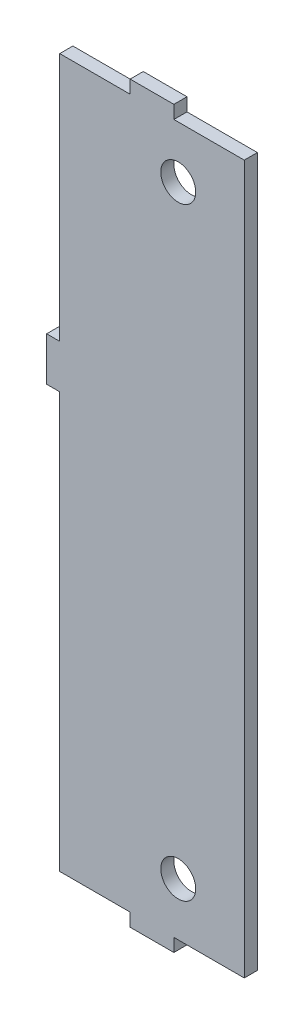
ISO-10303-21;
HEADER;
FILE_DESCRIPTION(('STEP AP214'),'2;1');
FILE_NAME('part.step','',(''),(''),'','','');
FILE_SCHEMA(('AUTOMOTIVE_DESIGN { 1 0 10303 214 1 1 1 1 }'));
ENDSEC;
DATA;
#1=APPLICATION_CONTEXT('core data for automotive mechanical design processes');
#2=APPLICATION_PROTOCOL_DEFINITION('international standard','automotive_design',2000,#1);
#3=PRODUCT_CONTEXT('',#1,'mechanical');
#4=PRODUCT('Part','Part','',(#3));
#5=PRODUCT_RELATED_PRODUCT_CATEGORY('part','',(#4));
#6=PRODUCT_DEFINITION_FORMATION('','',#4);
#7=PRODUCT_DEFINITION_CONTEXT('part definition',#1,'design');
#8=PRODUCT_DEFINITION('design','',#6,#7);
#9=PRODUCT_DEFINITION_SHAPE('','',#8);
#10=(LENGTH_UNIT() NAMED_UNIT(*) SI_UNIT(.MILLI.,.METRE.));
#11=(NAMED_UNIT(*) PLANE_ANGLE_UNIT() SI_UNIT($,.RADIAN.));
#12=(NAMED_UNIT(*) SI_UNIT($,.STERADIAN.) SOLID_ANGLE_UNIT());
#13=UNCERTAINTY_MEASURE_WITH_UNIT(LENGTH_MEASURE(1.E-05),#10,'distance_accuracy_value','');
#14=(GEOMETRIC_REPRESENTATION_CONTEXT(3) GLOBAL_UNCERTAINTY_ASSIGNED_CONTEXT((#13)) GLOBAL_UNIT_ASSIGNED_CONTEXT((#10,
#11,#12)) REPRESENTATION_CONTEXT('',''));
#15=CARTESIAN_POINT('',(0.,0.,0.));
#16=DIRECTION('',(0.,0.,1.));
#17=DIRECTION('',(1.,0.,0.));
#18=AXIS2_PLACEMENT_3D('',#15,#16,#17);
#19=CARTESIAN_POINT('',(-21.1,-60.,1.5));
#20=DIRECTION('',(0.,-1.,0.));
#21=DIRECTION('',(0.,0.,-1.));
#22=AXIS2_PLACEMENT_3D('',#19,#20,#21);
#23=PLANE('',#22);
#24=DIRECTION('',(-1.,0.,0.));
#25=VECTOR('',#24,1.);
#26=CARTESIAN_POINT('',(-21.1,-60.,-1.5));
#27=LINE('',#26,#25);
#28=CARTESIAN_POINT('',(-21.1,-60.,-1.5));
#29=VERTEX_POINT('',#28);
#30=CARTESIAN_POINT('',(-24.1,-60.,-1.5));
#31=VERTEX_POINT('',#30);
#32=EDGE_CURVE('E178',#29,#31,#27,.T.);
#33=ORIENTED_EDGE('',*,*,#32,.T.);
#34=DIRECTION('',(0.,0.,-1.));
#35=VECTOR('',#34,1.);
#36=CARTESIAN_POINT('',(-24.1,-60.,1.5));
#37=LINE('',#36,#35);
#38=CARTESIAN_POINT('',(-24.1,-60.,1.5));
#39=VERTEX_POINT('',#38);
#40=EDGE_CURVE('E11',#39,#31,#37,.T.);
#41=ORIENTED_EDGE('',*,*,#40,.F.);
#42=DIRECTION('',(-1.,0.,0.));
#43=VECTOR('',#42,1.);
#44=CARTESIAN_POINT('',(-21.1,-60.,1.5));
#45=LINE('',#44,#43);
#46=CARTESIAN_POINT('',(-21.1,-60.,1.5));
#47=VERTEX_POINT('',#46);
#48=EDGE_CURVE('E209',#47,#39,#45,.T.);
#49=ORIENTED_EDGE('',*,*,#48,.F.);
#50=DIRECTION('',(0.,0.,-1.));
#51=VECTOR('',#50,1.);
#52=CARTESIAN_POINT('',(-21.1,-60.,1.5));
#53=LINE('',#52,#51);
#54=EDGE_CURVE('E174',#47,#29,#53,.T.);
#55=ORIENTED_EDGE('',*,*,#54,.T.);
#56=EDGE_LOOP('',(#33,#41,#49,#55));
#57=FACE_BOUND('',#56,.T.);
#58=ADVANCED_FACE('F34',(#57),#23,.F.);
#59=CARTESIAN_POINT('',(-24.1,-60.,1.5));
#60=DIRECTION('',(1.,0.,0.));
#61=DIRECTION('',(0.,0.,-1.));
#62=AXIS2_PLACEMENT_3D('',#59,#60,#61);
#63=PLANE('',#62);
#64=DIRECTION('',(0.,-1.,0.));
#65=VECTOR('',#64,1.);
#66=CARTESIAN_POINT('',(-24.1,-60.,-1.5));
#67=LINE('',#66,#65);
#68=CARTESIAN_POINT('',(-24.1,-70.,-1.5));
#69=VERTEX_POINT('',#68);
#70=EDGE_CURVE('E181',#31,#69,#67,.T.);
#71=ORIENTED_EDGE('',*,*,#70,.T.);
#72=DIRECTION('',(0.,0.,-1.));
#73=VECTOR('',#72,1.);
#74=CARTESIAN_POINT('',(-24.1,-70.,1.5));
#75=LINE('',#74,#73);
#76=CARTESIAN_POINT('',(-24.1,-70.,1.5));
#77=VERTEX_POINT('',#76);
#78=EDGE_CURVE('E42',#77,#69,#75,.T.);
#79=ORIENTED_EDGE('',*,*,#78,.F.);
#80=DIRECTION('',(0.,-1.,0.));
#81=VECTOR('',#80,1.);
#82=CARTESIAN_POINT('',(-24.1,-60.,1.5));
#83=LINE('',#82,#81);
#84=EDGE_CURVE('E117',#39,#77,#83,.T.);
#85=ORIENTED_EDGE('',*,*,#84,.F.);
#86=ORIENTED_EDGE('',*,*,#40,.T.);
#87=EDGE_LOOP('',(#71,#79,#85,#86));
#88=FACE_BOUND('',#87,.T.);
#89=ADVANCED_FACE('F309',(#88),#63,.F.);
#90=CARTESIAN_POINT('',(-24.1,-70.,1.5));
#91=DIRECTION('',(0.,1.,0.));
#92=DIRECTION('',(0.,0.,1.));
#93=AXIS2_PLACEMENT_3D('',#90,#91,#92);
#94=PLANE('',#93);
#95=DIRECTION('',(1.,0.,0.));
#96=VECTOR('',#95,1.);
#97=CARTESIAN_POINT('',(-24.1,-70.,-1.5));
#98=LINE('',#97,#96);
#99=CARTESIAN_POINT('',(-21.1,-70.,-1.5));
#100=VERTEX_POINT('',#99);
#101=EDGE_CURVE('E184',#69,#100,#98,.T.);
#102=ORIENTED_EDGE('',*,*,#101,.T.);
#103=DIRECTION('',(0.,0.,-1.));
#104=VECTOR('',#103,1.);
#105=CARTESIAN_POINT('',(-21.1,-70.,1.5));
#106=LINE('',#105,#104);
#107=CARTESIAN_POINT('',(-21.1,-70.,1.5));
#108=VERTEX_POINT('',#107);
#109=EDGE_CURVE('E240',#108,#100,#106,.T.);
#110=ORIENTED_EDGE('',*,*,#109,.F.);
#111=DIRECTION('',(1.,0.,0.));
#112=VECTOR('',#111,1.);
#113=CARTESIAN_POINT('',(-24.1,-70.,1.5));
#114=LINE('',#113,#112);
#115=EDGE_CURVE('E248',#77,#108,#114,.T.);
#116=ORIENTED_EDGE('',*,*,#115,.F.);
#117=ORIENTED_EDGE('',*,*,#78,.T.);
#118=EDGE_LOOP('',(#102,#110,#116,#117));
#119=FACE_BOUND('',#118,.T.);
#120=ADVANCED_FACE('F246',(#119),#94,.F.);
#121=CARTESIAN_POINT('',(-21.1,-70.,1.5));
#122=DIRECTION('',(1.,0.,0.));
#123=DIRECTION('',(0.,1.,0.));
#124=AXIS2_PLACEMENT_3D('',#121,#122,#123);
#125=PLANE('',#124);
#126=DIRECTION('',(0.,-1.,0.));
#127=VECTOR('',#126,1.);
#128=CARTESIAN_POINT('',(-21.1,-70.,-1.5));
#129=LINE('',#128,#127);
#130=CARTESIAN_POINT('',(-21.1,-165.,-1.5));
#131=VERTEX_POINT('',#130);
#132=EDGE_CURVE('E186',#100,#131,#129,.T.);
#133=ORIENTED_EDGE('',*,*,#132,.T.);
#134=DIRECTION('',(0.,0.,-1.));
#135=VECTOR('',#134,1.);
#136=CARTESIAN_POINT('',(-21.1,-165.,1.5));
#137=LINE('',#136,#135);
#138=CARTESIAN_POINT('',(-21.1,-165.,1.5));
#139=VERTEX_POINT('',#138);
#140=EDGE_CURVE('E237',#139,#131,#137,.T.);
#141=ORIENTED_EDGE('',*,*,#140,.F.);
#142=DIRECTION('',(0.,-1.,0.));
#143=VECTOR('',#142,1.);
#144=CARTESIAN_POINT('',(-21.1,-70.,1.5));
#145=LINE('',#144,#143);
#146=EDGE_CURVE('E266',#108,#139,#145,.T.);
#147=ORIENTED_EDGE('',*,*,#146,.F.);
#148=ORIENTED_EDGE('',*,*,#109,.T.);
#149=EDGE_LOOP('',(#133,#141,#147,#148));
#150=FACE_BOUND('',#149,.T.);
#151=ADVANCED_FACE('F257',(#150),#125,.F.);
#152=CARTESIAN_POINT('',(-21.1,-165.,1.5));
#153=DIRECTION('',(0.,1.,0.));
#154=DIRECTION('',(0.,0.,1.));
#155=AXIS2_PLACEMENT_3D('',#152,#153,#154);
#156=PLANE('',#155);
#157=DIRECTION('',(1.,0.,0.));
#158=VECTOR('',#157,1.);
#159=CARTESIAN_POINT('',(-21.1,-165.,-1.5));
#160=LINE('',#159,#158);
#161=CARTESIAN_POINT('',(-4.99999999999998,-165.,-1.5));
#162=VERTEX_POINT('',#161);
#163=EDGE_CURVE('E188',#131,#162,#160,.T.);
#164=ORIENTED_EDGE('',*,*,#163,.T.);
#165=DIRECTION('',(0.,0.,-1.));
#166=VECTOR('',#165,1.);
#167=CARTESIAN_POINT('',(-4.99999999999998,-165.,1.5));
#168=LINE('',#167,#166);
#169=CARTESIAN_POINT('',(-4.99999999999998,-165.,1.5));
#170=VERTEX_POINT('',#169);
#171=EDGE_CURVE('E234',#170,#162,#168,.T.);
#172=ORIENTED_EDGE('',*,*,#171,.F.);
#173=DIRECTION('',(1.,0.,0.));
#174=VECTOR('',#173,1.);
#175=CARTESIAN_POINT('',(-21.1,-165.,1.5));
#176=LINE('',#175,#174);
#177=EDGE_CURVE('E263',#139,#170,#176,.T.);
#178=ORIENTED_EDGE('',*,*,#177,.F.);
#179=ORIENTED_EDGE('',*,*,#140,.T.);
#180=EDGE_LOOP('',(#164,#172,#178,#179));
#181=FACE_BOUND('',#180,.T.);
#182=ADVANCED_FACE('F261',(#181),#156,.F.);
#183=CARTESIAN_POINT('',(-4.99999999999998,-165.,1.5));
#184=DIRECTION('',(1.,0.,0.));
#185=DIRECTION('',(0.,1.,0.));
#186=AXIS2_PLACEMENT_3D('',#183,#184,#185);
#187=PLANE('',#186);
#188=DIRECTION('',(0.,-1.,0.));
#189=VECTOR('',#188,1.);
#190=CARTESIAN_POINT('',(-4.99999999999998,-165.,-1.5));
#191=LINE('',#190,#189);
#192=CARTESIAN_POINT('',(-4.99999999999998,-168.,-1.5));
#193=VERTEX_POINT('',#192);
#194=EDGE_CURVE('E190',#162,#193,#191,.T.);
#195=ORIENTED_EDGE('',*,*,#194,.T.);
#196=DIRECTION('',(0.,0.,-1.));
#197=VECTOR('',#196,1.);
#198=CARTESIAN_POINT('',(-4.99999999999998,-168.,1.5));
#199=LINE('',#198,#197);
#200=CARTESIAN_POINT('',(-4.99999999999998,-168.,1.5));
#201=VERTEX_POINT('',#200);
#202=EDGE_CURVE('E231',#201,#193,#199,.T.);
#203=ORIENTED_EDGE('',*,*,#202,.F.);
#204=DIRECTION('',(0.,-1.,0.));
#205=VECTOR('',#204,1.);
#206=CARTESIAN_POINT('',(-4.99999999999998,-165.,1.5));
#207=LINE('',#206,#205);
#208=EDGE_CURVE('E265',#170,#201,#207,.T.);
#209=ORIENTED_EDGE('',*,*,#208,.F.);
#210=ORIENTED_EDGE('',*,*,#171,.T.);
#211=EDGE_LOOP('',(#195,#203,#209,#210));
#212=FACE_BOUND('',#211,.T.);
#213=ADVANCED_FACE('F322',(#212),#187,.F.);
#214=CARTESIAN_POINT('',(-4.99999999999998,-168.,1.5));
#215=DIRECTION('',(0.,1.,0.));
#216=DIRECTION('',(0.,0.,1.));
#217=AXIS2_PLACEMENT_3D('',#214,#215,#216);
#218=PLANE('',#217);
#219=DIRECTION('',(1.,0.,0.));
#220=VECTOR('',#219,1.);
#221=CARTESIAN_POINT('',(-4.99999999999998,-168.,-1.5));
#222=LINE('',#221,#220);
#223=CARTESIAN_POINT('',(5.00000000000002,-168.,-1.5));
#224=VERTEX_POINT('',#223);
#225=EDGE_CURVE('E192',#193,#224,#222,.T.);
#226=ORIENTED_EDGE('',*,*,#225,.T.);
#227=DIRECTION('',(0.,0.,-1.));
#228=VECTOR('',#227,1.);
#229=CARTESIAN_POINT('',(5.00000000000002,-168.,1.5));
#230=LINE('',#229,#228);
#231=CARTESIAN_POINT('',(5.00000000000002,-168.,1.5));
#232=VERTEX_POINT('',#231);
#233=EDGE_CURVE('E228',#232,#224,#230,.T.);
#234=ORIENTED_EDGE('',*,*,#233,.F.);
#235=DIRECTION('',(1.,0.,0.));
#236=VECTOR('',#235,1.);
#237=CARTESIAN_POINT('',(-4.99999999999998,-168.,1.5));
#238=LINE('',#237,#236);
#239=EDGE_CURVE('E268',#201,#232,#238,.T.);
#240=ORIENTED_EDGE('',*,*,#239,.F.);
#241=ORIENTED_EDGE('',*,*,#202,.T.);
#242=EDGE_LOOP('',(#226,#234,#240,#241));
#243=FACE_BOUND('',#242,.T.);
#244=ADVANCED_FACE('F325',(#243),#218,.F.);
#245=CARTESIAN_POINT('',(5.00000000000002,-168.,1.5));
#246=DIRECTION('',(-1.,0.,0.));
#247=DIRECTION('',(0.,0.,1.));
#248=AXIS2_PLACEMENT_3D('',#245,#246,#247);
#249=PLANE('',#248);
#250=DIRECTION('',(0.,1.,0.));
#251=VECTOR('',#250,1.);
#252=CARTESIAN_POINT('',(5.00000000000002,-168.,-1.5));
#253=LINE('',#252,#251);
#254=CARTESIAN_POINT('',(5.00000000000002,-165.,-1.5));
#255=VERTEX_POINT('',#254);
#256=EDGE_CURVE('E194',#224,#255,#253,.T.);
#257=ORIENTED_EDGE('',*,*,#256,.T.);
#258=DIRECTION('',(0.,0.,-1.));
#259=VECTOR('',#258,1.);
#260=CARTESIAN_POINT('',(5.00000000000002,-165.,1.5));
#261=LINE('',#260,#259);
#262=CARTESIAN_POINT('',(5.00000000000002,-165.,1.5));
#263=VERTEX_POINT('',#262);
#264=EDGE_CURVE('E225',#263,#255,#261,.T.);
#265=ORIENTED_EDGE('',*,*,#264,.F.);
#266=DIRECTION('',(0.,1.,0.));
#267=VECTOR('',#266,1.);
#268=CARTESIAN_POINT('',(5.00000000000002,-168.,1.5));
#269=LINE('',#268,#267);
#270=EDGE_CURVE('E274',#232,#263,#269,.T.);
#271=ORIENTED_EDGE('',*,*,#270,.F.);
#272=ORIENTED_EDGE('',*,*,#233,.T.);
#273=EDGE_LOOP('',(#257,#265,#271,#272));
#274=FACE_BOUND('',#273,.T.);
#275=ADVANCED_FACE('F329',(#274),#249,.F.);
#276=CARTESIAN_POINT('',(5.00000000000002,-165.,1.5));
#277=DIRECTION('',(0.,1.,0.));
#278=DIRECTION('',(0.,0.,1.));
#279=AXIS2_PLACEMENT_3D('',#276,#277,#278);
#280=PLANE('',#279);
#281=DIRECTION('',(1.,0.,0.));
#282=VECTOR('',#281,1.);
#283=CARTESIAN_POINT('',(5.00000000000002,-165.,-1.5));
#284=LINE('',#283,#282);
#285=CARTESIAN_POINT('',(21.1,-165.,-1.5));
#286=VERTEX_POINT('',#285);
#287=EDGE_CURVE('E196',#255,#286,#284,.T.);
#288=ORIENTED_EDGE('',*,*,#287,.T.);
#289=DIRECTION('',(0.,0.,-1.));
#290=VECTOR('',#289,1.);
#291=CARTESIAN_POINT('',(21.1,-165.,1.5));
#292=LINE('',#291,#290);
#293=CARTESIAN_POINT('',(21.1,-165.,1.5));
#294=VERTEX_POINT('',#293);
#295=EDGE_CURVE('E222',#294,#286,#292,.T.);
#296=ORIENTED_EDGE('',*,*,#295,.F.);
#297=DIRECTION('',(1.,0.,0.));
#298=VECTOR('',#297,1.);
#299=CARTESIAN_POINT('',(5.00000000000002,-165.,1.5));
#300=LINE('',#299,#298);
#301=EDGE_CURVE('E276',#263,#294,#300,.T.);
#302=ORIENTED_EDGE('',*,*,#301,.F.);
#303=ORIENTED_EDGE('',*,*,#264,.T.);
#304=EDGE_LOOP('',(#288,#296,#302,#303));
#305=FACE_BOUND('',#304,.T.);
#306=ADVANCED_FACE('F333',(#305),#280,.F.);
#307=CARTESIAN_POINT('',(21.1,-3.,1.5));
#308=DIRECTION('',(-1.,0.,0.));
#309=DIRECTION('',(0.,0.,1.));
#310=AXIS2_PLACEMENT_3D('',#307,#308,#309);
#311=PLANE('',#310);
#312=DIRECTION('',(0.,1.,0.));
#313=VECTOR('',#312,1.);
#314=CARTESIAN_POINT('',(21.1,-3.,-1.5));
#315=LINE('',#314,#313);
#316=CARTESIAN_POINT('',(21.1,-3.,-1.5));
#317=VERTEX_POINT('',#316);
#318=EDGE_CURVE('E198',#286,#317,#315,.T.);
#319=ORIENTED_EDGE('',*,*,#318,.T.);
#320=DIRECTION('',(0.,0.,-1.));
#321=VECTOR('',#320,1.);
#322=CARTESIAN_POINT('',(21.1,-3.,1.5));
#323=LINE('',#322,#321);
#324=CARTESIAN_POINT('',(21.1,-3.,1.5));
#325=VERTEX_POINT('',#324);
#326=EDGE_CURVE('E219',#325,#317,#323,.T.);
#327=ORIENTED_EDGE('',*,*,#326,.F.);
#328=DIRECTION('',(0.,1.,0.));
#329=VECTOR('',#328,1.);
#330=CARTESIAN_POINT('',(21.1,-3.,1.5));
#331=LINE('',#330,#329);
#332=EDGE_CURVE('E278',#294,#325,#331,.T.);
#333=ORIENTED_EDGE('',*,*,#332,.F.);
#334=ORIENTED_EDGE('',*,*,#295,.T.);
#335=EDGE_LOOP('',(#319,#327,#333,#334));
#336=FACE_BOUND('',#335,.T.);
#337=ADVANCED_FACE('F337',(#336),#311,.F.);
#338=CARTESIAN_POINT('',(5.,-3.,1.5));
#339=DIRECTION('',(0.,-1.,0.));
#340=DIRECTION('',(0.,0.,-1.));
#341=AXIS2_PLACEMENT_3D('',#338,#339,#340);
#342=PLANE('',#341);
#343=DIRECTION('',(-1.,0.,0.));
#344=VECTOR('',#343,1.);
#345=CARTESIAN_POINT('',(5.,-3.,-1.5));
#346=LINE('',#345,#344);
#347=CARTESIAN_POINT('',(5.,-3.,-1.5));
#348=VERTEX_POINT('',#347);
#349=EDGE_CURVE('E200',#317,#348,#346,.T.);
#350=ORIENTED_EDGE('',*,*,#349,.T.);
#351=DIRECTION('',(0.,0.,-1.));
#352=VECTOR('',#351,1.);
#353=CARTESIAN_POINT('',(5.,-3.,1.5));
#354=LINE('',#353,#352);
#355=CARTESIAN_POINT('',(5.,-3.,1.5));
#356=VERTEX_POINT('',#355);
#357=EDGE_CURVE('E216',#356,#348,#354,.T.);
#358=ORIENTED_EDGE('',*,*,#357,.F.);
#359=DIRECTION('',(-1.,0.,0.));
#360=VECTOR('',#359,1.);
#361=CARTESIAN_POINT('',(5.,-3.,1.5));
#362=LINE('',#361,#360);
#363=EDGE_CURVE('E280',#325,#356,#362,.T.);
#364=ORIENTED_EDGE('',*,*,#363,.F.);
#365=ORIENTED_EDGE('',*,*,#326,.T.);
#366=EDGE_LOOP('',(#350,#358,#364,#365));
#367=FACE_BOUND('',#366,.T.);
#368=ADVANCED_FACE('F341',(#367),#342,.F.);
#369=CARTESIAN_POINT('',(5.,0.,1.5));
#370=DIRECTION('',(-1.,0.,0.));
#371=DIRECTION('',(0.,0.,1.));
#372=AXIS2_PLACEMENT_3D('',#369,#370,#371);
#373=PLANE('',#372);
#374=DIRECTION('',(0.,1.,0.));
#375=VECTOR('',#374,1.);
#376=CARTESIAN_POINT('',(5.,0.,-1.5));
#377=LINE('',#376,#375);
#378=CARTESIAN_POINT('',(5.,0.,-1.5));
#379=VERTEX_POINT('',#378);
#380=EDGE_CURVE('E202',#348,#379,#377,.T.);
#381=ORIENTED_EDGE('',*,*,#380,.T.);
#382=DIRECTION('',(0.,0.,-1.));
#383=VECTOR('',#382,1.);
#384=CARTESIAN_POINT('',(5.,0.,1.5));
#385=LINE('',#384,#383);
#386=CARTESIAN_POINT('',(5.,0.,1.5));
#387=VERTEX_POINT('',#386);
#388=EDGE_CURVE('E213',#387,#379,#385,.T.);
#389=ORIENTED_EDGE('',*,*,#388,.F.);
#390=DIRECTION('',(0.,1.,0.));
#391=VECTOR('',#390,1.);
#392=CARTESIAN_POINT('',(5.,0.,1.5));
#393=LINE('',#392,#391);
#394=EDGE_CURVE('E282',#356,#387,#393,.T.);
#395=ORIENTED_EDGE('',*,*,#394,.F.);
#396=ORIENTED_EDGE('',*,*,#357,.T.);
#397=EDGE_LOOP('',(#381,#389,#395,#396));
#398=FACE_BOUND('',#397,.T.);
#399=ADVANCED_FACE('F288',(#398),#373,.F.);
#400=CARTESIAN_POINT('',(-5.,0.,1.5));
#401=DIRECTION('',(0.,-1.,0.));
#402=DIRECTION('',(1.,0.,0.));
#403=AXIS2_PLACEMENT_3D('',#400,#401,#402);
#404=PLANE('',#403);
#405=DIRECTION('',(-1.,0.,0.));
#406=VECTOR('',#405,1.);
#407=CARTESIAN_POINT('',(-5.,0.,-1.5));
#408=LINE('',#407,#406);
#409=CARTESIAN_POINT('',(-5.,0.,-1.5));
#410=VERTEX_POINT('',#409);
#411=EDGE_CURVE('E204',#379,#410,#408,.T.);
#412=ORIENTED_EDGE('',*,*,#411,.T.);
#413=DIRECTION('',(0.,0.,-1.));
#414=VECTOR('',#413,1.);
#415=CARTESIAN_POINT('',(-5.,0.,1.5));
#416=LINE('',#415,#414);
#417=CARTESIAN_POINT('',(-5.,0.,1.5));
#418=VERTEX_POINT('',#417);
#419=EDGE_CURVE('E169',#418,#410,#416,.T.);
#420=ORIENTED_EDGE('',*,*,#419,.F.);
#421=DIRECTION('',(-1.,0.,0.));
#422=VECTOR('',#421,1.);
#423=CARTESIAN_POINT('',(-5.,0.,1.5));
#424=LINE('',#423,#422);
#425=EDGE_CURVE('E160',#387,#418,#424,.T.);
#426=ORIENTED_EDGE('',*,*,#425,.F.);
#427=ORIENTED_EDGE('',*,*,#388,.T.);
#428=EDGE_LOOP('',(#412,#420,#426,#427));
#429=FACE_BOUND('',#428,.T.);
#430=ADVANCED_FACE('F292',(#429),#404,.F.);
#431=CARTESIAN_POINT('',(-5.,0.,1.5));
#432=DIRECTION('',(1.,0.,0.));
#433=DIRECTION('',(0.,0.,-1.));
#434=AXIS2_PLACEMENT_3D('',#431,#432,#433);
#435=PLANE('',#434);
#436=DIRECTION('',(0.,-1.,0.));
#437=VECTOR('',#436,1.);
#438=CARTESIAN_POINT('',(-5.,0.,-1.5));
#439=LINE('',#438,#437);
#440=CARTESIAN_POINT('',(-5.,-3.,-1.5));
#441=VERTEX_POINT('',#440);
#442=EDGE_CURVE('E168',#410,#441,#439,.T.);
#443=ORIENTED_EDGE('',*,*,#442,.T.);
#444=DIRECTION('',(0.,0.,-1.));
#445=VECTOR('',#444,1.);
#446=CARTESIAN_POINT('',(-5.,-3.,1.5));
#447=LINE('',#446,#445);
#448=CARTESIAN_POINT('',(-5.,-3.,1.5));
#449=VERTEX_POINT('',#448);
#450=EDGE_CURVE('E165',#449,#441,#447,.T.);
#451=ORIENTED_EDGE('',*,*,#450,.F.);
#452=DIRECTION('',(0.,-1.,0.));
#453=VECTOR('',#452,1.);
#454=CARTESIAN_POINT('',(-5.,0.,1.5));
#455=LINE('',#454,#453);
#456=EDGE_CURVE('E154',#418,#449,#455,.T.);
#457=ORIENTED_EDGE('',*,*,#456,.F.);
#458=ORIENTED_EDGE('',*,*,#419,.T.);
#459=EDGE_LOOP('',(#443,#451,#457,#458));
#460=FACE_BOUND('',#459,.T.);
#461=ADVANCED_FACE('F166',(#460),#435,.F.);
#462=CARTESIAN_POINT('',(-5.,-3.,1.5));
#463=DIRECTION('',(0.,-1.,0.));
#464=DIRECTION('',(1.,0.,0.));
#465=AXIS2_PLACEMENT_3D('',#462,#463,#464);
#466=PLANE('',#465);
#467=DIRECTION('',(-1.,0.,0.));
#468=VECTOR('',#467,1.);
#469=CARTESIAN_POINT('',(-5.,-3.,-1.5));
#470=LINE('',#469,#468);
#471=CARTESIAN_POINT('',(-21.1,-3.,-1.5));
#472=VERTEX_POINT('',#471);
#473=EDGE_CURVE('E103',#441,#472,#470,.T.);
#474=ORIENTED_EDGE('',*,*,#473,.T.);
#475=DIRECTION('',(0.,0.,-1.));
#476=VECTOR('',#475,1.);
#477=CARTESIAN_POINT('',(-21.1,-3.,1.5));
#478=LINE('',#477,#476);
#479=CARTESIAN_POINT('',(-21.1,-3.,1.5));
#480=VERTEX_POINT('',#479);
#481=EDGE_CURVE('E170',#480,#472,#478,.T.);
#482=ORIENTED_EDGE('',*,*,#481,.F.);
#483=DIRECTION('',(-1.,0.,0.));
#484=VECTOR('',#483,1.);
#485=CARTESIAN_POINT('',(-5.,-3.,1.5));
#486=LINE('',#485,#484);
#487=EDGE_CURVE('E158',#449,#480,#486,.T.);
#488=ORIENTED_EDGE('',*,*,#487,.F.);
#489=ORIENTED_EDGE('',*,*,#450,.T.);
#490=EDGE_LOOP('',(#474,#482,#488,#489));
#491=FACE_BOUND('',#490,.T.);
#492=ADVANCED_FACE('F172',(#491),#466,.F.);
#493=CARTESIAN_POINT('',(-21.1,-3.,1.5));
#494=DIRECTION('',(1.,0.,0.));
#495=DIRECTION('',(0.,1.,0.));
#496=AXIS2_PLACEMENT_3D('',#493,#494,#495);
#497=PLANE('',#496);
#498=DIRECTION('',(0.,-1.,0.));
#499=VECTOR('',#498,1.);
#500=CARTESIAN_POINT('',(-21.1,-3.,-1.5));
#501=LINE('',#500,#499);
#502=EDGE_CURVE('E109',#472,#29,#501,.T.);
#503=ORIENTED_EDGE('',*,*,#502,.T.);
#504=ORIENTED_EDGE('',*,*,#54,.F.);
#505=DIRECTION('',(0.,-1.,0.));
#506=VECTOR('',#505,1.);
#507=CARTESIAN_POINT('',(-21.1,-3.,1.5));
#508=LINE('',#507,#506);
#509=EDGE_CURVE('E50',#480,#47,#508,.T.);
#510=ORIENTED_EDGE('',*,*,#509,.F.);
#511=ORIENTED_EDGE('',*,*,#481,.T.);
#512=EDGE_LOOP('',(#503,#504,#510,#511));
#513=FACE_BOUND('',#512,.T.);
#514=ADVANCED_FACE('F296',(#513),#497,.F.);
#515=CARTESIAN_POINT('',(0.,0.,1.5));
#516=DIRECTION('',(0.,0.,1.));
#517=DIRECTION('',(1.,0.,0.));
#518=AXIS2_PLACEMENT_3D('',#515,#516,#517);
#519=PLANE('',#518);
#520=CARTESIAN_POINT('',(6.0000000000006,-14.9000000000008,1.5));
#521=DIRECTION('',(0.,0.,1.));
#522=DIRECTION('',(1.,0.,0.));
#523=AXIS2_PLACEMENT_3D('',#520,#521,#522);
#524=CIRCLE('',#523,4.);
#525=CARTESIAN_POINT('',(10.0000000000006,-14.9000000000008,1.5));
#526=VERTEX_POINT('',#525);
#527=EDGE_CURVE('E406',#526,#526,#524,.T.);
#528=ORIENTED_EDGE('',*,*,#527,.F.);
#529=EDGE_LOOP('',(#528));
#530=FACE_BOUND('',#529,.T.);
#531=CARTESIAN_POINT('',(6.00000000000063,-152.900000000001,1.5));
#532=DIRECTION('',(0.,0.,1.));
#533=DIRECTION('',(1.,0.,0.));
#534=AXIS2_PLACEMENT_3D('',#531,#532,#533);
#535=CIRCLE('',#534,4.);
#536=CARTESIAN_POINT('',(10.0000000000006,-152.900000000001,1.5));
#537=VERTEX_POINT('',#536);
#538=EDGE_CURVE('E408',#537,#537,#535,.T.);
#539=ORIENTED_EDGE('',*,*,#538,.F.);
#540=EDGE_LOOP('',(#539));
#541=FACE_BOUND('',#540,.T.);
#542=ORIENTED_EDGE('',*,*,#48,.T.);
#543=ORIENTED_EDGE('',*,*,#84,.T.);
#544=ORIENTED_EDGE('',*,*,#115,.T.);
#545=ORIENTED_EDGE('',*,*,#146,.T.);
#546=ORIENTED_EDGE('',*,*,#177,.T.);
#547=ORIENTED_EDGE('',*,*,#208,.T.);
#548=ORIENTED_EDGE('',*,*,#239,.T.);
#549=ORIENTED_EDGE('',*,*,#270,.T.);
#550=ORIENTED_EDGE('',*,*,#301,.T.);
#551=ORIENTED_EDGE('',*,*,#332,.T.);
#552=ORIENTED_EDGE('',*,*,#363,.T.);
#553=ORIENTED_EDGE('',*,*,#394,.T.);
#554=ORIENTED_EDGE('',*,*,#425,.T.);
#555=ORIENTED_EDGE('',*,*,#456,.T.);
#556=ORIENTED_EDGE('',*,*,#487,.T.);
#557=ORIENTED_EDGE('',*,*,#509,.T.);
#558=EDGE_LOOP('',(#542,#543,#544,#545,#546,#547,#548,#549,#550,#551,#552,#553,#554,#555,#556,#557));
#559=FACE_BOUND('',#558,.T.);
#560=ADVANCED_FACE('F156',(#530,#541,#559),#519,.T.);
#561=CARTESIAN_POINT('',(0.,0.,-1.5));
#562=DIRECTION('',(0.,0.,1.));
#563=DIRECTION('',(1.,0.,0.));
#564=AXIS2_PLACEMENT_3D('',#561,#562,#563);
#565=PLANE('',#564);
#566=CARTESIAN_POINT('',(6.0000000000006,-14.9000000000008,-1.5));
#567=DIRECTION('',(0.,0.,1.));
#568=DIRECTION('',(1.,0.,0.));
#569=AXIS2_PLACEMENT_3D('',#566,#567,#568);
#570=CIRCLE('',#569,4.);
#571=CARTESIAN_POINT('',(10.0000000000006,-14.9000000000008,-1.5));
#572=VERTEX_POINT('',#571);
#573=EDGE_CURVE('E403',#572,#572,#570,.T.);
#574=ORIENTED_EDGE('',*,*,#573,.T.);
#575=EDGE_LOOP('',(#574));
#576=FACE_BOUND('',#575,.T.);
#577=CARTESIAN_POINT('',(6.00000000000063,-152.900000000001,-1.5));
#578=DIRECTION('',(0.,0.,1.));
#579=DIRECTION('',(1.,0.,0.));
#580=AXIS2_PLACEMENT_3D('',#577,#578,#579);
#581=CIRCLE('',#580,4.);
#582=CARTESIAN_POINT('',(10.0000000000006,-152.900000000001,-1.5));
#583=VERTEX_POINT('',#582);
#584=EDGE_CURVE('E182',#583,#583,#581,.T.);
#585=ORIENTED_EDGE('',*,*,#584,.T.);
#586=EDGE_LOOP('',(#585));
#587=FACE_BOUND('',#586,.T.);
#588=ORIENTED_EDGE('',*,*,#32,.F.);
#589=ORIENTED_EDGE('',*,*,#502,.F.);
#590=ORIENTED_EDGE('',*,*,#473,.F.);
#591=ORIENTED_EDGE('',*,*,#442,.F.);
#592=ORIENTED_EDGE('',*,*,#411,.F.);
#593=ORIENTED_EDGE('',*,*,#380,.F.);
#594=ORIENTED_EDGE('',*,*,#349,.F.);
#595=ORIENTED_EDGE('',*,*,#318,.F.);
#596=ORIENTED_EDGE('',*,*,#287,.F.);
#597=ORIENTED_EDGE('',*,*,#256,.F.);
#598=ORIENTED_EDGE('',*,*,#225,.F.);
#599=ORIENTED_EDGE('',*,*,#194,.F.);
#600=ORIENTED_EDGE('',*,*,#163,.F.);
#601=ORIENTED_EDGE('',*,*,#132,.F.);
#602=ORIENTED_EDGE('',*,*,#101,.F.);
#603=ORIENTED_EDGE('',*,*,#70,.F.);
#604=EDGE_LOOP('',(#588,#589,#590,#591,#592,#593,#594,#595,#596,#597,#598,#599,#600,#601,#602,#603));
#605=FACE_BOUND('',#604,.T.);
#606=ADVANCED_FACE('F252',(#576,#587,#605),#565,.F.);
#607=CARTESIAN_POINT('',(6.00000000000063,-152.900000000001,1.5));
#608=DIRECTION('',(0.,0.,1.));
#609=DIRECTION('',(1.,0.,0.));
#610=AXIS2_PLACEMENT_3D('',#607,#608,#609);
#611=CYLINDRICAL_SURFACE('',#610,4.);
#612=ORIENTED_EDGE('',*,*,#584,.F.);
#613=EDGE_LOOP('',(#612));
#614=FACE_BOUND('',#613,.T.);
#615=ORIENTED_EDGE('',*,*,#538,.T.);
#616=EDGE_LOOP('',(#615));
#617=FACE_BOUND('',#616,.T.);
#618=ADVANCED_FACE('F374',(#614,#617),#611,.F.);
#619=CARTESIAN_POINT('',(6.0000000000006,-14.9000000000008,1.5));
#620=DIRECTION('',(0.,0.,1.));
#621=DIRECTION('',(1.,0.,0.));
#622=AXIS2_PLACEMENT_3D('',#619,#620,#621);
#623=CYLINDRICAL_SURFACE('',#622,4.);
#624=ORIENTED_EDGE('',*,*,#573,.F.);
#625=EDGE_LOOP('',(#624));
#626=FACE_BOUND('',#625,.T.);
#627=ORIENTED_EDGE('',*,*,#527,.T.);
#628=EDGE_LOOP('',(#627));
#629=FACE_BOUND('',#628,.T.);
#630=ADVANCED_FACE('F383',(#626,#629),#623,.F.);
#631=CLOSED_SHELL('',(#58,#89,#120,#151,#182,#213,#244,#275,#306,#337,#368,#399,#430,#461,#492,
#514,#560,#606,#618,#630));
#632=MANIFOLD_SOLID_BREP('B2',#631);
#633=ADVANCED_BREP_SHAPE_REPRESENTATION('',(#18,#632),#14);
#634=SHAPE_DEFINITION_REPRESENTATION(#9,#633);
ENDSEC;
END-ISO-10303-21;
